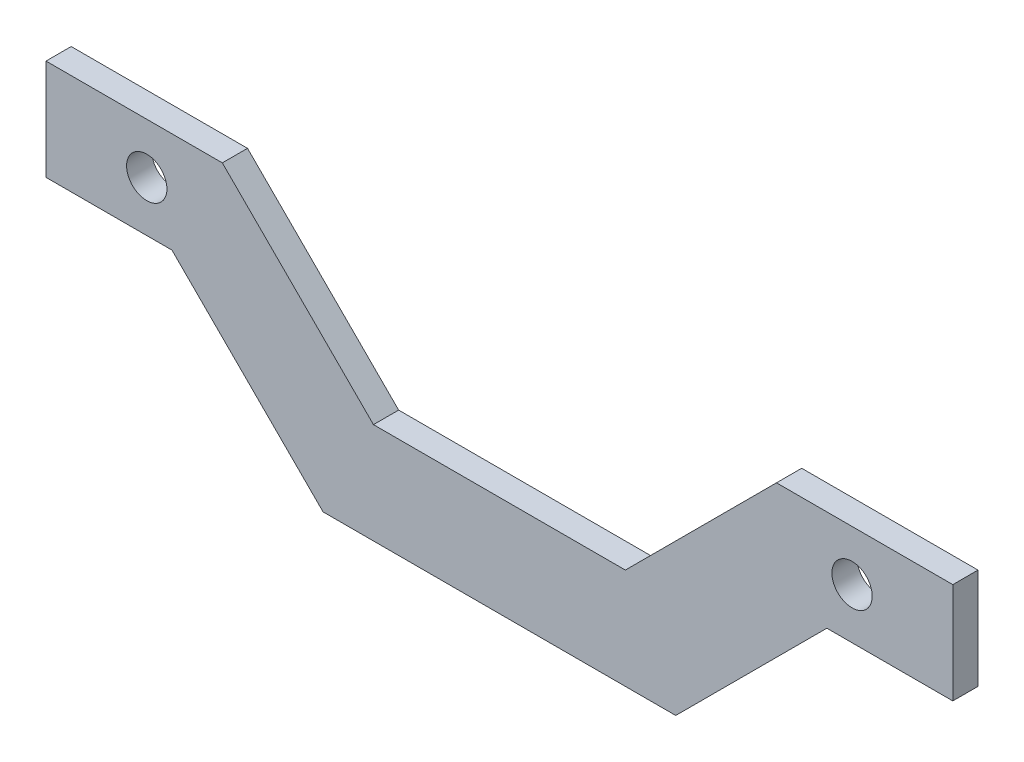
ISO-10303-21;
HEADER;
FILE_DESCRIPTION(('STEP AP214'),'2;1');
FILE_NAME('part.step','',(''),(''),'','','');
FILE_SCHEMA(('AUTOMOTIVE_DESIGN { 1 0 10303 214 1 1 1 1 }'));
ENDSEC;
DATA;
#1=APPLICATION_CONTEXT('core data for automotive mechanical design processes');
#2=APPLICATION_PROTOCOL_DEFINITION('international standard','automotive_design',2000,#1);
#3=PRODUCT_CONTEXT('',#1,'mechanical');
#4=PRODUCT('Part','Part','',(#3));
#5=PRODUCT_RELATED_PRODUCT_CATEGORY('part','',(#4));
#6=PRODUCT_DEFINITION_FORMATION('','',#4);
#7=PRODUCT_DEFINITION_CONTEXT('part definition',#1,'design');
#8=PRODUCT_DEFINITION('design','',#6,#7);
#9=PRODUCT_DEFINITION_SHAPE('','',#8);
#10=(LENGTH_UNIT() NAMED_UNIT(*) SI_UNIT(.MILLI.,.METRE.));
#11=(NAMED_UNIT(*) PLANE_ANGLE_UNIT() SI_UNIT($,.RADIAN.));
#12=(NAMED_UNIT(*) SI_UNIT($,.STERADIAN.) SOLID_ANGLE_UNIT());
#13=UNCERTAINTY_MEASURE_WITH_UNIT(LENGTH_MEASURE(1.E-05),#10,'distance_accuracy_value','');
#14=(GEOMETRIC_REPRESENTATION_CONTEXT(3) GLOBAL_UNCERTAINTY_ASSIGNED_CONTEXT((#13)) GLOBAL_UNIT_ASSIGNED_CONTEXT((#10,
#11,#12)) REPRESENTATION_CONTEXT('',''));
#15=CARTESIAN_POINT('',(0.,0.,0.));
#16=DIRECTION('',(0.,0.,1.));
#17=DIRECTION('',(1.,0.,0.));
#18=AXIS2_PLACEMENT_3D('',#15,#16,#17);
#19=CARTESIAN_POINT('',(-35.,0.,5.));
#20=DIRECTION('',(0.707106781186549,0.707106781186546,0.));
#21=DIRECTION('',(-0.707106781186546,0.707106781186549,0.));
#22=AXIS2_PLACEMENT_3D('',#19,#20,#21);
#23=PLANE('',#22);
#24=DIRECTION('',(0.707106781186546,-0.707106781186549,0.));
#25=VECTOR('',#24,1.);
#26=CARTESIAN_POINT('',(-35.,0.,0.));
#27=LINE('',#26,#25);
#28=CARTESIAN_POINT('',(-65.,30.0000000000001,0.));
#29=VERTEX_POINT('',#28);
#30=CARTESIAN_POINT('',(-35.,0.,0.));
#31=VERTEX_POINT('',#30);
#32=EDGE_CURVE('E159',#29,#31,#27,.T.);
#33=ORIENTED_EDGE('',*,*,#32,.T.);
#34=DIRECTION('',(0.,0.,-1.));
#35=VECTOR('',#34,1.);
#36=CARTESIAN_POINT('',(-35.,0.,5.));
#37=LINE('',#36,#35);
#38=CARTESIAN_POINT('',(-35.,0.,5.));
#39=VERTEX_POINT('',#38);
#40=EDGE_CURVE('E11',#39,#31,#37,.T.);
#41=ORIENTED_EDGE('',*,*,#40,.F.);
#42=DIRECTION('',(0.707106781186546,-0.707106781186549,0.));
#43=VECTOR('',#42,1.);
#44=CARTESIAN_POINT('',(-35.,0.,5.));
#45=LINE('',#44,#43);
#46=CARTESIAN_POINT('',(-65.,30.0000000000001,5.));
#47=VERTEX_POINT('',#46);
#48=EDGE_CURVE('E182',#47,#39,#45,.T.);
#49=ORIENTED_EDGE('',*,*,#48,.F.);
#50=DIRECTION('',(0.,0.,-1.));
#51=VECTOR('',#50,1.);
#52=CARTESIAN_POINT('',(-65.,30.0000000000001,5.));
#53=LINE('',#52,#51);
#54=EDGE_CURVE('E155',#47,#29,#53,.T.);
#55=ORIENTED_EDGE('',*,*,#54,.T.);
#56=EDGE_LOOP('',(#33,#41,#49,#55));
#57=FACE_BOUND('',#56,.T.);
#58=ADVANCED_FACE('F39',(#57),#23,.F.);
#59=CARTESIAN_POINT('',(35.,0.,5.));
#60=DIRECTION('',(0.,1.,0.));
#61=DIRECTION('',(-1.,0.,0.));
#62=AXIS2_PLACEMENT_3D('',#59,#60,#61);
#63=PLANE('',#62);
#64=DIRECTION('',(1.,0.,0.));
#65=VECTOR('',#64,1.);
#66=CARTESIAN_POINT('',(35.,0.,0.));
#67=LINE('',#66,#65);
#68=CARTESIAN_POINT('',(35.,0.,0.));
#69=VERTEX_POINT('',#68);
#70=EDGE_CURVE('E162',#31,#69,#67,.T.);
#71=ORIENTED_EDGE('',*,*,#70,.T.);
#72=DIRECTION('',(0.,0.,-1.));
#73=VECTOR('',#72,1.);
#74=CARTESIAN_POINT('',(35.,0.,5.));
#75=LINE('',#74,#73);
#76=CARTESIAN_POINT('',(35.,0.,5.));
#77=VERTEX_POINT('',#76);
#78=EDGE_CURVE('E47',#77,#69,#75,.T.);
#79=ORIENTED_EDGE('',*,*,#78,.F.);
#80=DIRECTION('',(1.,0.,0.));
#81=VECTOR('',#80,1.);
#82=CARTESIAN_POINT('',(35.,0.,5.));
#83=LINE('',#82,#81);
#84=EDGE_CURVE('E110',#39,#77,#83,.T.);
#85=ORIENTED_EDGE('',*,*,#84,.F.);
#86=ORIENTED_EDGE('',*,*,#40,.T.);
#87=EDGE_LOOP('',(#71,#79,#85,#86));
#88=FACE_BOUND('',#87,.T.);
#89=ADVANCED_FACE('F261',(#88),#63,.F.);
#90=CARTESIAN_POINT('',(35.,0.,5.));
#91=DIRECTION('',(-0.707106781186549,0.707106781186546,0.));
#92=DIRECTION('',(-0.707106781186546,-0.707106781186549,0.));
#93=AXIS2_PLACEMENT_3D('',#90,#91,#92);
#94=PLANE('',#93);
#95=DIRECTION('',(0.707106781186546,0.707106781186549,0.));
#96=VECTOR('',#95,1.);
#97=CARTESIAN_POINT('',(35.,0.,0.));
#98=LINE('',#97,#96);
#99=CARTESIAN_POINT('',(65.,30.0000000000001,0.));
#100=VERTEX_POINT('',#99);
#101=EDGE_CURVE('E165',#69,#100,#98,.T.);
#102=ORIENTED_EDGE('',*,*,#101,.T.);
#103=DIRECTION('',(0.,0.,-1.));
#104=VECTOR('',#103,1.);
#105=CARTESIAN_POINT('',(65.,30.0000000000001,5.));
#106=LINE('',#105,#104);
#107=CARTESIAN_POINT('',(65.,30.0000000000001,5.));
#108=VERTEX_POINT('',#107);
#109=EDGE_CURVE('E201',#108,#100,#106,.T.);
#110=ORIENTED_EDGE('',*,*,#109,.F.);
#111=DIRECTION('',(0.707106781186546,0.707106781186549,0.));
#112=VECTOR('',#111,1.);
#113=CARTESIAN_POINT('',(35.,0.,5.));
#114=LINE('',#113,#112);
#115=EDGE_CURVE('E209',#77,#108,#114,.T.);
#116=ORIENTED_EDGE('',*,*,#115,.F.);
#117=ORIENTED_EDGE('',*,*,#78,.T.);
#118=EDGE_LOOP('',(#102,#110,#116,#117));
#119=FACE_BOUND('',#118,.T.);
#120=ADVANCED_FACE('F207',(#119),#94,.F.);
#121=CARTESIAN_POINT('',(65.,30.0000000000001,5.));
#122=DIRECTION('',(0.,1.,0.));
#123=DIRECTION('',(0.,0.,1.));
#124=AXIS2_PLACEMENT_3D('',#121,#122,#123);
#125=PLANE('',#124);
#126=DIRECTION('',(1.,0.,0.));
#127=VECTOR('',#126,1.);
#128=CARTESIAN_POINT('',(65.,30.0000000000001,0.));
#129=LINE('',#128,#127);
#130=CARTESIAN_POINT('',(90.,30.0000000000001,0.));
#131=VERTEX_POINT('',#130);
#132=EDGE_CURVE('E167',#100,#131,#129,.T.);
#133=ORIENTED_EDGE('',*,*,#132,.T.);
#134=DIRECTION('',(0.,0.,-1.));
#135=VECTOR('',#134,1.);
#136=CARTESIAN_POINT('',(90.,30.0000000000001,5.));
#137=LINE('',#136,#135);
#138=CARTESIAN_POINT('',(90.,30.0000000000001,5.));
#139=VERTEX_POINT('',#138);
#140=EDGE_CURVE('E198',#139,#131,#137,.T.);
#141=ORIENTED_EDGE('',*,*,#140,.F.);
#142=DIRECTION('',(1.,0.,0.));
#143=VECTOR('',#142,1.);
#144=CARTESIAN_POINT('',(65.,30.0000000000001,5.));
#145=LINE('',#144,#143);
#146=EDGE_CURVE('E227',#108,#139,#145,.T.);
#147=ORIENTED_EDGE('',*,*,#146,.F.);
#148=ORIENTED_EDGE('',*,*,#109,.T.);
#149=EDGE_LOOP('',(#133,#141,#147,#148));
#150=FACE_BOUND('',#149,.T.);
#151=ADVANCED_FACE('F218',(#150),#125,.F.);
#152=CARTESIAN_POINT('',(90.,30.0000000000001,5.));
#153=DIRECTION('',(-1.,0.,0.));
#154=DIRECTION('',(0.,0.,1.));
#155=AXIS2_PLACEMENT_3D('',#152,#153,#154);
#156=PLANE('',#155);
#157=DIRECTION('',(0.,1.,0.));
#158=VECTOR('',#157,1.);
#159=CARTESIAN_POINT('',(90.,30.0000000000001,0.));
#160=LINE('',#159,#158);
#161=CARTESIAN_POINT('',(90.,50.0000000000001,0.));
#162=VERTEX_POINT('',#161);
#163=EDGE_CURVE('E169',#131,#162,#160,.T.);
#164=ORIENTED_EDGE('',*,*,#163,.T.);
#165=DIRECTION('',(0.,0.,-1.));
#166=VECTOR('',#165,1.);
#167=CARTESIAN_POINT('',(90.,50.0000000000001,5.));
#168=LINE('',#167,#166);
#169=CARTESIAN_POINT('',(90.,50.0000000000001,5.));
#170=VERTEX_POINT('',#169);
#171=EDGE_CURVE('E195',#170,#162,#168,.T.);
#172=ORIENTED_EDGE('',*,*,#171,.F.);
#173=DIRECTION('',(0.,1.,0.));
#174=VECTOR('',#173,1.);
#175=CARTESIAN_POINT('',(90.,30.0000000000001,5.));
#176=LINE('',#175,#174);
#177=EDGE_CURVE('E224',#139,#170,#176,.T.);
#178=ORIENTED_EDGE('',*,*,#177,.F.);
#179=ORIENTED_EDGE('',*,*,#140,.T.);
#180=EDGE_LOOP('',(#164,#172,#178,#179));
#181=FACE_BOUND('',#180,.T.);
#182=ADVANCED_FACE('F222',(#181),#156,.F.);
#183=CARTESIAN_POINT('',(90.,50.0000000000001,5.));
#184=DIRECTION('',(0.,-1.,0.));
#185=DIRECTION('',(0.,0.,-1.));
#186=AXIS2_PLACEMENT_3D('',#183,#184,#185);
#187=PLANE('',#186);
#188=DIRECTION('',(-1.,0.,0.));
#189=VECTOR('',#188,1.);
#190=CARTESIAN_POINT('',(90.,50.0000000000001,0.));
#191=LINE('',#190,#189);
#192=CARTESIAN_POINT('',(55.,50.0000000000001,0.));
#193=VERTEX_POINT('',#192);
#194=EDGE_CURVE('E171',#162,#193,#191,.T.);
#195=ORIENTED_EDGE('',*,*,#194,.T.);
#196=DIRECTION('',(0.,0.,-1.));
#197=VECTOR('',#196,1.);
#198=CARTESIAN_POINT('',(55.,50.0000000000001,5.));
#199=LINE('',#198,#197);
#200=CARTESIAN_POINT('',(55.,50.0000000000001,5.));
#201=VERTEX_POINT('',#200);
#202=EDGE_CURVE('E192',#201,#193,#199,.T.);
#203=ORIENTED_EDGE('',*,*,#202,.F.);
#204=DIRECTION('',(-1.,0.,0.));
#205=VECTOR('',#204,1.);
#206=CARTESIAN_POINT('',(90.,50.0000000000001,5.));
#207=LINE('',#206,#205);
#208=EDGE_CURVE('E226',#170,#201,#207,.T.);
#209=ORIENTED_EDGE('',*,*,#208,.F.);
#210=ORIENTED_EDGE('',*,*,#171,.T.);
#211=EDGE_LOOP('',(#195,#203,#209,#210));
#212=FACE_BOUND('',#211,.T.);
#213=ADVANCED_FACE('F274',(#212),#187,.F.);
#214=CARTESIAN_POINT('',(55.,50.0000000000001,5.));
#215=DIRECTION('',(0.707106781186549,-0.707106781186546,0.));
#216=DIRECTION('',(0.707106781186546,0.707106781186549,0.));
#217=AXIS2_PLACEMENT_3D('',#214,#215,#216);
#218=PLANE('',#217);
#219=DIRECTION('',(-0.707106781186546,-0.707106781186549,0.));
#220=VECTOR('',#219,1.);
#221=CARTESIAN_POINT('',(55.,50.0000000000001,0.));
#222=LINE('',#221,#220);
#223=CARTESIAN_POINT('',(25.,20.,0.));
#224=VERTEX_POINT('',#223);
#225=EDGE_CURVE('E173',#193,#224,#222,.T.);
#226=ORIENTED_EDGE('',*,*,#225,.T.);
#227=DIRECTION('',(0.,0.,-1.));
#228=VECTOR('',#227,1.);
#229=CARTESIAN_POINT('',(25.,20.,5.));
#230=LINE('',#229,#228);
#231=CARTESIAN_POINT('',(25.,20.,5.));
#232=VERTEX_POINT('',#231);
#233=EDGE_CURVE('E189',#232,#224,#230,.T.);
#234=ORIENTED_EDGE('',*,*,#233,.F.);
#235=DIRECTION('',(-0.707106781186546,-0.707106781186549,0.));
#236=VECTOR('',#235,1.);
#237=CARTESIAN_POINT('',(55.,50.0000000000001,5.));
#238=LINE('',#237,#236);
#239=EDGE_CURVE('E229',#201,#232,#238,.T.);
#240=ORIENTED_EDGE('',*,*,#239,.F.);
#241=ORIENTED_EDGE('',*,*,#202,.T.);
#242=EDGE_LOOP('',(#226,#234,#240,#241));
#243=FACE_BOUND('',#242,.T.);
#244=ADVANCED_FACE('F277',(#243),#218,.F.);
#245=CARTESIAN_POINT('',(-25.,20.,5.));
#246=DIRECTION('',(0.,-1.,0.));
#247=DIRECTION('',(0.,0.,-1.));
#248=AXIS2_PLACEMENT_3D('',#245,#246,#247);
#249=PLANE('',#248);
#250=DIRECTION('',(-1.,0.,0.));
#251=VECTOR('',#250,1.);
#252=CARTESIAN_POINT('',(-25.,20.,0.));
#253=LINE('',#252,#251);
#254=CARTESIAN_POINT('',(-25.,20.,0.));
#255=VERTEX_POINT('',#254);
#256=EDGE_CURVE('E175',#224,#255,#253,.T.);
#257=ORIENTED_EDGE('',*,*,#256,.T.);
#258=DIRECTION('',(0.,0.,-1.));
#259=VECTOR('',#258,1.);
#260=CARTESIAN_POINT('',(-25.,20.,5.));
#261=LINE('',#260,#259);
#262=CARTESIAN_POINT('',(-25.,20.,5.));
#263=VERTEX_POINT('',#262);
#264=EDGE_CURVE('E186',#263,#255,#261,.T.);
#265=ORIENTED_EDGE('',*,*,#264,.F.);
#266=DIRECTION('',(-1.,0.,0.));
#267=VECTOR('',#266,1.);
#268=CARTESIAN_POINT('',(-25.,20.,5.));
#269=LINE('',#268,#267);
#270=EDGE_CURVE('E235',#232,#263,#269,.T.);
#271=ORIENTED_EDGE('',*,*,#270,.F.);
#272=ORIENTED_EDGE('',*,*,#233,.T.);
#273=EDGE_LOOP('',(#257,#265,#271,#272));
#274=FACE_BOUND('',#273,.T.);
#275=ADVANCED_FACE('F241',(#274),#249,.F.);
#276=CARTESIAN_POINT('',(-55.,50.0000000000001,5.));
#277=DIRECTION('',(-0.707106781186549,-0.707106781186546,0.));
#278=DIRECTION('',(0.707106781186546,-0.707106781186549,0.));
#279=AXIS2_PLACEMENT_3D('',#276,#277,#278);
#280=PLANE('',#279);
#281=DIRECTION('',(-0.707106781186546,0.707106781186549,0.));
#282=VECTOR('',#281,1.);
#283=CARTESIAN_POINT('',(-55.,50.0000000000001,0.));
#284=LINE('',#283,#282);
#285=CARTESIAN_POINT('',(-55.,50.0000000000001,0.));
#286=VERTEX_POINT('',#285);
#287=EDGE_CURVE('E177',#255,#286,#284,.T.);
#288=ORIENTED_EDGE('',*,*,#287,.T.);
#289=DIRECTION('',(0.,0.,-1.));
#290=VECTOR('',#289,1.);
#291=CARTESIAN_POINT('',(-55.,50.0000000000001,5.));
#292=LINE('',#291,#290);
#293=CARTESIAN_POINT('',(-55.,50.0000000000001,5.));
#294=VERTEX_POINT('',#293);
#295=EDGE_CURVE('E150',#294,#286,#292,.T.);
#296=ORIENTED_EDGE('',*,*,#295,.F.);
#297=DIRECTION('',(-0.707106781186546,0.707106781186549,0.));
#298=VECTOR('',#297,1.);
#299=CARTESIAN_POINT('',(-55.,50.0000000000001,5.));
#300=LINE('',#299,#298);
#301=EDGE_CURVE('E141',#263,#294,#300,.T.);
#302=ORIENTED_EDGE('',*,*,#301,.F.);
#303=ORIENTED_EDGE('',*,*,#264,.T.);
#304=EDGE_LOOP('',(#288,#296,#302,#303));
#305=FACE_BOUND('',#304,.T.);
#306=ADVANCED_FACE('F245',(#305),#280,.F.);
#307=CARTESIAN_POINT('',(-90.,50.0000000000001,5.));
#308=DIRECTION('',(0.,-1.,0.));
#309=DIRECTION('',(0.,0.,-1.));
#310=AXIS2_PLACEMENT_3D('',#307,#308,#309);
#311=PLANE('',#310);
#312=DIRECTION('',(-1.,0.,0.));
#313=VECTOR('',#312,1.);
#314=CARTESIAN_POINT('',(-90.,50.0000000000001,0.));
#315=LINE('',#314,#313);
#316=CARTESIAN_POINT('',(-90.,50.0000000000001,0.));
#317=VERTEX_POINT('',#316);
#318=EDGE_CURVE('E149',#286,#317,#315,.T.);
#319=ORIENTED_EDGE('',*,*,#318,.T.);
#320=DIRECTION('',(0.,0.,-1.));
#321=VECTOR('',#320,1.);
#322=CARTESIAN_POINT('',(-90.,50.0000000000001,5.));
#323=LINE('',#322,#321);
#324=CARTESIAN_POINT('',(-90.,50.0000000000001,5.));
#325=VERTEX_POINT('',#324);
#326=EDGE_CURVE('E146',#325,#317,#323,.T.);
#327=ORIENTED_EDGE('',*,*,#326,.F.);
#328=DIRECTION('',(-1.,0.,0.));
#329=VECTOR('',#328,1.);
#330=CARTESIAN_POINT('',(-90.,50.0000000000001,5.));
#331=LINE('',#330,#329);
#332=EDGE_CURVE('E135',#294,#325,#331,.T.);
#333=ORIENTED_EDGE('',*,*,#332,.F.);
#334=ORIENTED_EDGE('',*,*,#295,.T.);
#335=EDGE_LOOP('',(#319,#327,#333,#334));
#336=FACE_BOUND('',#335,.T.);
#337=ADVANCED_FACE('F147',(#336),#311,.F.);
#338=CARTESIAN_POINT('',(-90.,30.0000000000001,5.));
#339=DIRECTION('',(1.,0.,0.));
#340=DIRECTION('',(0.,0.,-1.));
#341=AXIS2_PLACEMENT_3D('',#338,#339,#340);
#342=PLANE('',#341);
#343=DIRECTION('',(0.,-1.,0.));
#344=VECTOR('',#343,1.);
#345=CARTESIAN_POINT('',(-90.,30.0000000000001,0.));
#346=LINE('',#345,#344);
#347=CARTESIAN_POINT('',(-90.,30.0000000000001,0.));
#348=VERTEX_POINT('',#347);
#349=EDGE_CURVE('E96',#317,#348,#346,.T.);
#350=ORIENTED_EDGE('',*,*,#349,.T.);
#351=DIRECTION('',(0.,0.,-1.));
#352=VECTOR('',#351,1.);
#353=CARTESIAN_POINT('',(-90.,30.0000000000001,5.));
#354=LINE('',#353,#352);
#355=CARTESIAN_POINT('',(-90.,30.0000000000001,5.));
#356=VERTEX_POINT('',#355);
#357=EDGE_CURVE('E151',#356,#348,#354,.T.);
#358=ORIENTED_EDGE('',*,*,#357,.F.);
#359=DIRECTION('',(0.,-1.,0.));
#360=VECTOR('',#359,1.);
#361=CARTESIAN_POINT('',(-90.,30.0000000000001,5.));
#362=LINE('',#361,#360);
#363=EDGE_CURVE('E139',#325,#356,#362,.T.);
#364=ORIENTED_EDGE('',*,*,#363,.F.);
#365=ORIENTED_EDGE('',*,*,#326,.T.);
#366=EDGE_LOOP('',(#350,#358,#364,#365));
#367=FACE_BOUND('',#366,.T.);
#368=ADVANCED_FACE('F153',(#367),#342,.F.);
#369=CARTESIAN_POINT('',(-65.,30.0000000000001,5.));
#370=DIRECTION('',(0.,1.,0.));
#371=DIRECTION('',(0.,0.,1.));
#372=AXIS2_PLACEMENT_3D('',#369,#370,#371);
#373=PLANE('',#372);
#374=DIRECTION('',(1.,0.,0.));
#375=VECTOR('',#374,1.);
#376=CARTESIAN_POINT('',(-65.,30.0000000000001,0.));
#377=LINE('',#376,#375);
#378=EDGE_CURVE('E102',#348,#29,#377,.T.);
#379=ORIENTED_EDGE('',*,*,#378,.T.);
#380=ORIENTED_EDGE('',*,*,#54,.F.);
#381=DIRECTION('',(1.,0.,0.));
#382=VECTOR('',#381,1.);
#383=CARTESIAN_POINT('',(-65.,30.0000000000001,5.));
#384=LINE('',#383,#382);
#385=EDGE_CURVE('E55',#356,#47,#384,.T.);
#386=ORIENTED_EDGE('',*,*,#385,.F.);
#387=ORIENTED_EDGE('',*,*,#357,.T.);
#388=EDGE_LOOP('',(#379,#380,#386,#387));
#389=FACE_BOUND('',#388,.T.);
#390=ADVANCED_FACE('F249',(#389),#373,.F.);
#391=CARTESIAN_POINT('',(0.,0.,5.));
#392=DIRECTION('',(0.,0.,1.));
#393=DIRECTION('',(1.,0.,0.));
#394=AXIS2_PLACEMENT_3D('',#391,#392,#393);
#395=PLANE('',#394);
#396=CARTESIAN_POINT('',(-70.,40.0000000000001,5.));
#397=DIRECTION('',(0.,0.,1.));
#398=DIRECTION('',(1.,0.,0.));
#399=AXIS2_PLACEMENT_3D('',#396,#397,#398);
#400=CIRCLE('',#399,4.00000000000001);
#401=CARTESIAN_POINT('',(-66.,40.0000000000001,5.));
#402=VERTEX_POINT('',#401);
#403=EDGE_CURVE('E163',#402,#402,#400,.T.);
#404=ORIENTED_EDGE('',*,*,#403,.F.);
#405=EDGE_LOOP('',(#404));
#406=FACE_BOUND('',#405,.T.);
#407=CARTESIAN_POINT('',(70.,40.0000000000001,5.));
#408=DIRECTION('',(0.,0.,1.));
#409=DIRECTION('',(1.,0.,0.));
#410=AXIS2_PLACEMENT_3D('',#407,#408,#409);
#411=CIRCLE('',#410,4.00000000000001);
#412=CARTESIAN_POINT('',(74.,40.0000000000001,5.));
#413=VERTEX_POINT('',#412);
#414=EDGE_CURVE('E331',#413,#413,#411,.T.);
#415=ORIENTED_EDGE('',*,*,#414,.F.);
#416=EDGE_LOOP('',(#415));
#417=FACE_BOUND('',#416,.T.);
#418=ORIENTED_EDGE('',*,*,#48,.T.);
#419=ORIENTED_EDGE('',*,*,#84,.T.);
#420=ORIENTED_EDGE('',*,*,#115,.T.);
#421=ORIENTED_EDGE('',*,*,#146,.T.);
#422=ORIENTED_EDGE('',*,*,#177,.T.);
#423=ORIENTED_EDGE('',*,*,#208,.T.);
#424=ORIENTED_EDGE('',*,*,#239,.T.);
#425=ORIENTED_EDGE('',*,*,#270,.T.);
#426=ORIENTED_EDGE('',*,*,#301,.T.);
#427=ORIENTED_EDGE('',*,*,#332,.T.);
#428=ORIENTED_EDGE('',*,*,#363,.T.);
#429=ORIENTED_EDGE('',*,*,#385,.T.);
#430=EDGE_LOOP('',(#418,#419,#420,#421,#422,#423,#424,#425,#426,#427,#428,#429));
#431=FACE_BOUND('',#430,.T.);
#432=ADVANCED_FACE('F137',(#406,#417,#431),#395,.T.);
#433=CARTESIAN_POINT('',(0.,0.,0.));
#434=DIRECTION('',(0.,0.,1.));
#435=DIRECTION('',(1.,0.,0.));
#436=AXIS2_PLACEMENT_3D('',#433,#434,#435);
#437=PLANE('',#436);
#438=CARTESIAN_POINT('',(-70.,40.0000000000001,0.));
#439=DIRECTION('',(0.,0.,-1.));
#440=DIRECTION('',(-1.,0.,0.));
#441=AXIS2_PLACEMENT_3D('',#438,#439,#440);
#442=CIRCLE('',#441,4.00000000000001);
#443=CARTESIAN_POINT('',(-74.,40.0000000000001,0.));
#444=VERTEX_POINT('',#443);
#445=EDGE_CURVE('E330',#444,#444,#442,.T.);
#446=ORIENTED_EDGE('',*,*,#445,.F.);
#447=EDGE_LOOP('',(#446));
#448=FACE_BOUND('',#447,.T.);
#449=CARTESIAN_POINT('',(70.,40.0000000000001,0.));
#450=DIRECTION('',(0.,0.,-1.));
#451=DIRECTION('',(1.,0.,0.));
#452=AXIS2_PLACEMENT_3D('',#449,#450,#451);
#453=CIRCLE('',#452,4.00000000000001);
#454=CARTESIAN_POINT('',(74.,40.0000000000001,0.));
#455=VERTEX_POINT('',#454);
#456=EDGE_CURVE('E332',#455,#455,#453,.T.);
#457=ORIENTED_EDGE('',*,*,#456,.F.);
#458=EDGE_LOOP('',(#457));
#459=FACE_BOUND('',#458,.T.);
#460=ORIENTED_EDGE('',*,*,#32,.F.);
#461=ORIENTED_EDGE('',*,*,#378,.F.);
#462=ORIENTED_EDGE('',*,*,#349,.F.);
#463=ORIENTED_EDGE('',*,*,#318,.F.);
#464=ORIENTED_EDGE('',*,*,#287,.F.);
#465=ORIENTED_EDGE('',*,*,#256,.F.);
#466=ORIENTED_EDGE('',*,*,#225,.F.);
#467=ORIENTED_EDGE('',*,*,#194,.F.);
#468=ORIENTED_EDGE('',*,*,#163,.F.);
#469=ORIENTED_EDGE('',*,*,#132,.F.);
#470=ORIENTED_EDGE('',*,*,#101,.F.);
#471=ORIENTED_EDGE('',*,*,#70,.F.);
#472=EDGE_LOOP('',(#460,#461,#462,#463,#464,#465,#466,#467,#468,#469,#470,#471));
#473=FACE_BOUND('',#472,.T.);
#474=ADVANCED_FACE('F213',(#448,#459,#473),#437,.F.);
#475=CARTESIAN_POINT('',(70.,40.0000000000001,10.));
#476=DIRECTION('',(0.,0.,-1.));
#477=DIRECTION('',(-1.,0.,0.));
#478=AXIS2_PLACEMENT_3D('',#475,#476,#477);
#479=CYLINDRICAL_SURFACE('',#478,4.00000000000001);
#480=ORIENTED_EDGE('',*,*,#414,.T.);
#481=EDGE_LOOP('',(#480));
#482=FACE_BOUND('',#481,.T.);
#483=ORIENTED_EDGE('',*,*,#456,.T.);
#484=EDGE_LOOP('',(#483));
#485=FACE_BOUND('',#484,.T.);
#486=ADVANCED_FACE('F308',(#482,#485),#479,.F.);
#487=CARTESIAN_POINT('',(-70.,40.0000000000001,10.));
#488=DIRECTION('',(0.,0.,-1.));
#489=DIRECTION('',(-1.,0.,0.));
#490=AXIS2_PLACEMENT_3D('',#487,#488,#489);
#491=CYLINDRICAL_SURFACE('',#490,4.00000000000001);
#492=ORIENTED_EDGE('',*,*,#403,.T.);
#493=EDGE_LOOP('',(#492));
#494=FACE_BOUND('',#493,.T.);
#495=ORIENTED_EDGE('',*,*,#445,.T.);
#496=EDGE_LOOP('',(#495));
#497=FACE_BOUND('',#496,.T.);
#498=ADVANCED_FACE('F315',(#494,#497),#491,.F.);
#499=CLOSED_SHELL('',(#58,#89,#120,#151,#182,#213,#244,#275,#306,#337,#368,#390,#432,#474,#486,#498));
#500=MANIFOLD_SOLID_BREP('B2',#499);
#501=ADVANCED_BREP_SHAPE_REPRESENTATION('',(#18,#500),#14);
#502=SHAPE_DEFINITION_REPRESENTATION(#9,#501);
ENDSEC;
END-ISO-10303-21;
